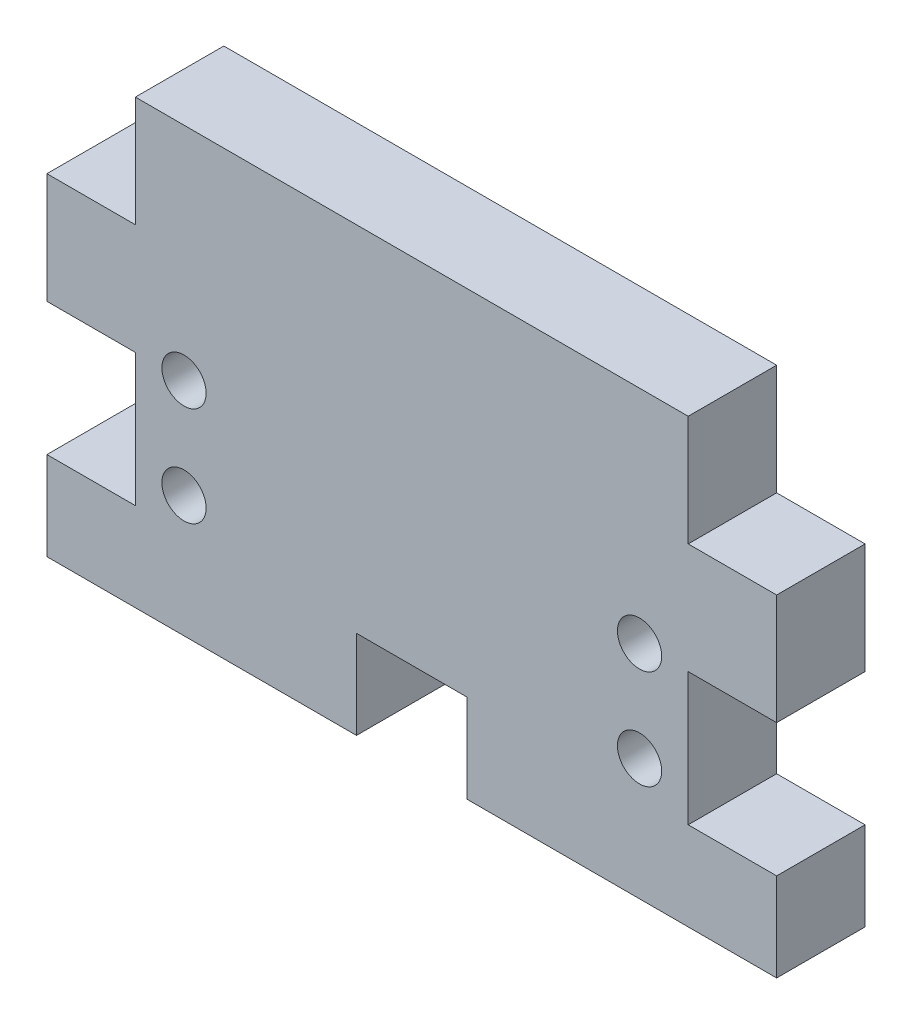
ISO-10303-21;
HEADER;
FILE_DESCRIPTION(('STEP AP214'),'2;1');
FILE_NAME('part.step','',(''),(''),'','','');
FILE_SCHEMA(('AUTOMOTIVE_DESIGN { 1 0 10303 214 1 1 1 1 }'));
ENDSEC;
DATA;
#1=APPLICATION_CONTEXT('core data for automotive mechanical design processes');
#2=APPLICATION_PROTOCOL_DEFINITION('international standard','automotive_design',2000,#1);
#3=PRODUCT_CONTEXT('',#1,'mechanical');
#4=PRODUCT('Part','Part','',(#3));
#5=PRODUCT_RELATED_PRODUCT_CATEGORY('part','',(#4));
#6=PRODUCT_DEFINITION_FORMATION('','',#4);
#7=PRODUCT_DEFINITION_CONTEXT('part definition',#1,'design');
#8=PRODUCT_DEFINITION('design','',#6,#7);
#9=PRODUCT_DEFINITION_SHAPE('','',#8);
#10=(LENGTH_UNIT() NAMED_UNIT(*) SI_UNIT(.MILLI.,.METRE.));
#11=(NAMED_UNIT(*) PLANE_ANGLE_UNIT() SI_UNIT($,.RADIAN.));
#12=(NAMED_UNIT(*) SI_UNIT($,.STERADIAN.) SOLID_ANGLE_UNIT());
#13=UNCERTAINTY_MEASURE_WITH_UNIT(LENGTH_MEASURE(1.E-05),#10,'distance_accuracy_value','');
#14=(GEOMETRIC_REPRESENTATION_CONTEXT(3) GLOBAL_UNCERTAINTY_ASSIGNED_CONTEXT((#13)) GLOBAL_UNIT_ASSIGNED_CONTEXT((#10,
#11,#12)) REPRESENTATION_CONTEXT('',''));
#15=CARTESIAN_POINT('',(0.,0.,0.));
#16=DIRECTION('',(0.,0.,1.));
#17=DIRECTION('',(1.,0.,0.));
#18=AXIS2_PLACEMENT_3D('',#15,#16,#17);
#19=CARTESIAN_POINT('',(0.,0.,4.));
#20=DIRECTION('',(1.,0.,0.));
#21=DIRECTION('',(0.,0.,-1.));
#22=AXIS2_PLACEMENT_3D('',#19,#20,#21);
#23=PLANE('',#22);
#24=DIRECTION('',(0.,-1.,0.));
#25=VECTOR('',#24,1.);
#26=CARTESIAN_POINT('',(0.,0.,4.));
#27=LINE('',#26,#25);
#28=CARTESIAN_POINT('',(0.,4.00000000000002,4.));
#29=VERTEX_POINT('',#28);
#30=CARTESIAN_POINT('',(0.,0.,4.));
#31=VERTEX_POINT('',#30);
#32=EDGE_CURVE('E211',#29,#31,#27,.T.);
#33=ORIENTED_EDGE('',*,*,#32,.F.);
#34=DIRECTION('',(0.,0.,-1.));
#35=VECTOR('',#34,1.);
#36=CARTESIAN_POINT('',(0.,4.00000000000002,4.));
#37=LINE('',#36,#35);
#38=CARTESIAN_POINT('',(0.,4.00000000000002,0.));
#39=VERTEX_POINT('',#38);
#40=EDGE_CURVE('E320',#29,#39,#37,.T.);
#41=ORIENTED_EDGE('',*,*,#40,.T.);
#42=DIRECTION('',(0.,-1.,0.));
#43=VECTOR('',#42,1.);
#44=CARTESIAN_POINT('',(0.,0.,0.));
#45=LINE('',#44,#43);
#46=CARTESIAN_POINT('',(0.,0.,0.));
#47=VERTEX_POINT('',#46);
#48=EDGE_CURVE('E325',#39,#47,#45,.T.);
#49=ORIENTED_EDGE('',*,*,#48,.T.);
#50=DIRECTION('',(0.,0.,-1.));
#51=VECTOR('',#50,1.);
#52=CARTESIAN_POINT('',(0.,0.,4.));
#53=LINE('',#52,#51);
#54=EDGE_CURVE('E12',#31,#47,#53,.T.);
#55=ORIENTED_EDGE('',*,*,#54,.F.);
#56=EDGE_LOOP('',(#33,#41,#49,#55));
#57=FACE_BOUND('',#56,.T.);
#58=ADVANCED_FACE('F41',(#57),#23,.F.);
#59=CARTESIAN_POINT('',(0.,0.,4.));
#60=DIRECTION('',(0.,1.,0.));
#61=DIRECTION('',(0.,0.,1.));
#62=AXIS2_PLACEMENT_3D('',#59,#60,#61);
#63=PLANE('',#62);
#64=DIRECTION('',(1.,0.,0.));
#65=VECTOR('',#64,1.);
#66=CARTESIAN_POINT('',(0.,0.,0.));
#67=LINE('',#66,#65);
#68=CARTESIAN_POINT('',(14.,0.,0.));
#69=VERTEX_POINT('',#68);
#70=EDGE_CURVE('E345',#47,#69,#67,.T.);
#71=ORIENTED_EDGE('',*,*,#70,.T.);
#72=DIRECTION('',(0.,0.,-1.));
#73=VECTOR('',#72,1.);
#74=CARTESIAN_POINT('',(14.,0.,4.));
#75=LINE('',#74,#73);
#76=CARTESIAN_POINT('',(14.,0.,4.));
#77=VERTEX_POINT('',#76);
#78=EDGE_CURVE('E462',#77,#69,#75,.T.);
#79=ORIENTED_EDGE('',*,*,#78,.F.);
#80=DIRECTION('',(1.,0.,0.));
#81=VECTOR('',#80,1.);
#82=CARTESIAN_POINT('',(0.,0.,4.));
#83=LINE('',#82,#81);
#84=EDGE_CURVE('E215',#31,#77,#83,.T.);
#85=ORIENTED_EDGE('',*,*,#84,.F.);
#86=ORIENTED_EDGE('',*,*,#54,.T.);
#87=EDGE_LOOP('',(#71,#79,#85,#86));
#88=FACE_BOUND('',#87,.T.);
#89=ADVANCED_FACE('F383',(#88),#63,.F.);
#90=CARTESIAN_POINT('',(33.,0.,4.));
#91=DIRECTION('',(-1.,0.,0.));
#92=DIRECTION('',(0.,0.,1.));
#93=AXIS2_PLACEMENT_3D('',#90,#91,#92);
#94=PLANE('',#93);
#95=DIRECTION('',(0.,1.,0.));
#96=VECTOR('',#95,1.);
#97=CARTESIAN_POINT('',(33.,0.,0.));
#98=LINE('',#97,#96);
#99=CARTESIAN_POINT('',(33.,9.99999999999994,0.));
#100=VERTEX_POINT('',#99);
#101=CARTESIAN_POINT('',(33.,14.9999999999999,0.));
#102=VERTEX_POINT('',#101);
#103=EDGE_CURVE('E350',#100,#102,#98,.T.);
#104=ORIENTED_EDGE('',*,*,#103,.T.);
#105=DIRECTION('',(0.,0.,-1.));
#106=VECTOR('',#105,1.);
#107=CARTESIAN_POINT('',(33.,14.9999999999999,4.));
#108=LINE('',#107,#106);
#109=CARTESIAN_POINT('',(33.,14.9999999999999,4.));
#110=VERTEX_POINT('',#109);
#111=EDGE_CURVE('E298',#110,#102,#108,.T.);
#112=ORIENTED_EDGE('',*,*,#111,.F.);
#113=DIRECTION('',(0.,1.,0.));
#114=VECTOR('',#113,1.);
#115=CARTESIAN_POINT('',(33.,0.,4.));
#116=LINE('',#115,#114);
#117=CARTESIAN_POINT('',(33.,9.99999999999994,4.));
#118=VERTEX_POINT('',#117);
#119=EDGE_CURVE('E266',#118,#110,#116,.T.);
#120=ORIENTED_EDGE('',*,*,#119,.F.);
#121=DIRECTION('',(0.,0.,-1.));
#122=VECTOR('',#121,1.);
#123=CARTESIAN_POINT('',(33.,9.99999999999994,4.));
#124=LINE('',#123,#122);
#125=EDGE_CURVE('E286',#118,#100,#124,.T.);
#126=ORIENTED_EDGE('',*,*,#125,.T.);
#127=EDGE_LOOP('',(#104,#112,#120,#126));
#128=FACE_BOUND('',#127,.T.);
#129=ADVANCED_FACE('F388',(#128),#94,.F.);
#130=CARTESIAN_POINT('',(0.,15.,0.));
#131=VERTEX_POINT('',#130);
#132=CARTESIAN_POINT('',(0.,10.,0.));
#133=VERTEX_POINT('',#132);
#134=EDGE_CURVE('E199',#131,#133,#45,.T.);
#135=ORIENTED_EDGE('',*,*,#134,.T.);
#136=DIRECTION('',(0.,0.,-1.));
#137=VECTOR('',#136,1.);
#138=CARTESIAN_POINT('',(0.,10.,4.));
#139=LINE('',#138,#137);
#140=CARTESIAN_POINT('',(0.,10.,4.));
#141=VERTEX_POINT('',#140);
#142=EDGE_CURVE('E182',#141,#133,#139,.T.);
#143=ORIENTED_EDGE('',*,*,#142,.F.);
#144=CARTESIAN_POINT('',(0.,15.,4.));
#145=VERTEX_POINT('',#144);
#146=EDGE_CURVE('E197',#145,#141,#27,.T.);
#147=ORIENTED_EDGE('',*,*,#146,.F.);
#148=DIRECTION('',(0.,0.,-1.));
#149=VECTOR('',#148,1.);
#150=CARTESIAN_POINT('',(0.,15.,4.));
#151=LINE('',#150,#149);
#152=EDGE_CURVE('E326',#145,#131,#151,.T.);
#153=ORIENTED_EDGE('',*,*,#152,.T.);
#154=EDGE_LOOP('',(#135,#143,#147,#153));
#155=FACE_BOUND('',#154,.T.);
#156=ADVANCED_FACE('F43',(#155),#23,.F.);
#157=CARTESIAN_POINT('',(19.,0.,4.));
#158=VERTEX_POINT('',#157);
#159=CARTESIAN_POINT('',(33.,0.,4.));
#160=VERTEX_POINT('',#159);
#161=EDGE_CURVE('E210',#158,#160,#83,.T.);
#162=ORIENTED_EDGE('',*,*,#161,.F.);
#163=DIRECTION('',(0.,0.,-1.));
#164=VECTOR('',#163,1.);
#165=CARTESIAN_POINT('',(19.,0.,4.));
#166=LINE('',#165,#164);
#167=CARTESIAN_POINT('',(19.,0.,0.));
#168=VERTEX_POINT('',#167);
#169=EDGE_CURVE('E458',#158,#168,#166,.T.);
#170=ORIENTED_EDGE('',*,*,#169,.T.);
#171=CARTESIAN_POINT('',(33.,0.,0.));
#172=VERTEX_POINT('',#171);
#173=EDGE_CURVE('E342',#168,#172,#67,.T.);
#174=ORIENTED_EDGE('',*,*,#173,.T.);
#175=DIRECTION('',(0.,0.,-1.));
#176=VECTOR('',#175,1.);
#177=CARTESIAN_POINT('',(33.,0.,4.));
#178=LINE('',#177,#176);
#179=EDGE_CURVE('E50',#160,#172,#178,.T.);
#180=ORIENTED_EDGE('',*,*,#179,.F.);
#181=EDGE_LOOP('',(#162,#170,#174,#180));
#182=FACE_BOUND('',#181,.T.);
#183=ADVANCED_FACE('F390',(#182),#63,.F.);
#184=CARTESIAN_POINT('',(33.,3.99999999999996,0.));
#185=VERTEX_POINT('',#184);
#186=EDGE_CURVE('E351',#172,#185,#98,.T.);
#187=ORIENTED_EDGE('',*,*,#186,.T.);
#188=DIRECTION('',(0.,0.,-1.));
#189=VECTOR('',#188,1.);
#190=CARTESIAN_POINT('',(32.9999999999999,3.99999999999996,4.));
#191=LINE('',#190,#189);
#192=CARTESIAN_POINT('',(32.9999999999999,3.99999999999996,4.));
#193=VERTEX_POINT('',#192);
#194=EDGE_CURVE('E410',#193,#185,#191,.T.);
#195=ORIENTED_EDGE('',*,*,#194,.F.);
#196=EDGE_CURVE('E260',#160,#193,#116,.T.);
#197=ORIENTED_EDGE('',*,*,#196,.F.);
#198=ORIENTED_EDGE('',*,*,#179,.T.);
#199=EDGE_LOOP('',(#187,#195,#197,#198));
#200=FACE_BOUND('',#199,.T.);
#201=ADVANCED_FACE('F397',(#200),#94,.F.);
#202=CARTESIAN_POINT('',(0.,20.,4.));
#203=DIRECTION('',(0.,-1.,0.));
#204=DIRECTION('',(0.,0.,-1.));
#205=AXIS2_PLACEMENT_3D('',#202,#203,#204);
#206=PLANE('',#205);
#207=DIRECTION('',(-1.,0.,0.));
#208=VECTOR('',#207,1.);
#209=CARTESIAN_POINT('',(0.,20.,4.));
#210=LINE('',#209,#208);
#211=CARTESIAN_POINT('',(29.,20.,4.));
#212=VERTEX_POINT('',#211);
#213=CARTESIAN_POINT('',(3.99999999999996,20.,4.));
#214=VERTEX_POINT('',#213);
#215=EDGE_CURVE('E265',#212,#214,#210,.T.);
#216=ORIENTED_EDGE('',*,*,#215,.F.);
#217=DIRECTION('',(0.,0.,-1.));
#218=VECTOR('',#217,1.);
#219=CARTESIAN_POINT('',(29.,20.,4.));
#220=LINE('',#219,#218);
#221=CARTESIAN_POINT('',(29.,20.,0.));
#222=VERTEX_POINT('',#221);
#223=EDGE_CURVE('E302',#212,#222,#220,.T.);
#224=ORIENTED_EDGE('',*,*,#223,.T.);
#225=DIRECTION('',(-1.,0.,0.));
#226=VECTOR('',#225,1.);
#227=CARTESIAN_POINT('',(0.,20.,0.));
#228=LINE('',#227,#226);
#229=CARTESIAN_POINT('',(3.99999999999996,20.,0.));
#230=VERTEX_POINT('',#229);
#231=EDGE_CURVE('E217',#222,#230,#228,.T.);
#232=ORIENTED_EDGE('',*,*,#231,.T.);
#233=DIRECTION('',(0.,0.,-1.));
#234=VECTOR('',#233,1.);
#235=CARTESIAN_POINT('',(3.99999999999996,20.,4.));
#236=LINE('',#235,#234);
#237=EDGE_CURVE('E323',#214,#230,#236,.T.);
#238=ORIENTED_EDGE('',*,*,#237,.F.);
#239=EDGE_LOOP('',(#216,#224,#232,#238));
#240=FACE_BOUND('',#239,.T.);
#241=ADVANCED_FACE('F368',(#240),#206,.F.);
#242=CARTESIAN_POINT('',(0.,0.,4.));
#243=DIRECTION('',(0.,0.,-1.));
#244=DIRECTION('',(-1.,0.,0.));
#245=AXIS2_PLACEMENT_3D('',#242,#243,#244);
#246=PLANE('',#245);
#247=CARTESIAN_POINT('',(26.8,10.0000000000001,4.));
#248=DIRECTION('',(0.,0.,1.));
#249=DIRECTION('',(-1.,0.,0.));
#250=AXIS2_PLACEMENT_3D('',#247,#248,#249);
#251=CIRCLE('',#250,1.00000000000001);
#252=CARTESIAN_POINT('',(25.8,10.0000000000001,4.));
#253=VERTEX_POINT('',#252);
#254=EDGE_CURVE('E540',#253,#253,#251,.T.);
#255=ORIENTED_EDGE('',*,*,#254,.F.);
#256=EDGE_LOOP('',(#255));
#257=FACE_BOUND('',#256,.T.);
#258=CARTESIAN_POINT('',(6.19999999999987,5.50000000000007,4.));
#259=DIRECTION('',(0.,0.,1.));
#260=DIRECTION('',(1.,0.,0.));
#261=AXIS2_PLACEMENT_3D('',#258,#259,#260);
#262=CIRCLE('',#261,1.00000000000014);
#263=CARTESIAN_POINT('',(7.20000000000001,5.50000000000007,4.));
#264=VERTEX_POINT('',#263);
#265=EDGE_CURVE('E521',#264,#264,#262,.T.);
#266=ORIENTED_EDGE('',*,*,#265,.F.);
#267=EDGE_LOOP('',(#266));
#268=FACE_BOUND('',#267,.T.);
#269=CARTESIAN_POINT('',(26.8,5.5,4.));
#270=DIRECTION('',(0.,0.,1.));
#271=DIRECTION('',(-1.,0.,0.));
#272=AXIS2_PLACEMENT_3D('',#269,#270,#271);
#273=CIRCLE('',#272,1.00000000000001);
#274=CARTESIAN_POINT('',(25.8,5.5,4.));
#275=VERTEX_POINT('',#274);
#276=EDGE_CURVE('E532',#275,#275,#273,.T.);
#277=ORIENTED_EDGE('',*,*,#276,.F.);
#278=EDGE_LOOP('',(#277));
#279=FACE_BOUND('',#278,.T.);
#280=CARTESIAN_POINT('',(6.2,10.0000000000001,4.));
#281=DIRECTION('',(0.,0.,1.));
#282=DIRECTION('',(1.,0.,0.));
#283=AXIS2_PLACEMENT_3D('',#280,#281,#282);
#284=CIRCLE('',#283,1.);
#285=CARTESIAN_POINT('',(7.2,10.0000000000001,4.));
#286=VERTEX_POINT('',#285);
#287=EDGE_CURVE('E512',#286,#286,#284,.T.);
#288=ORIENTED_EDGE('',*,*,#287,.F.);
#289=EDGE_LOOP('',(#288));
#290=FACE_BOUND('',#289,.T.);
#291=ORIENTED_EDGE('',*,*,#119,.T.);
#292=DIRECTION('',(-1.,0.,0.));
#293=VECTOR('',#292,1.);
#294=CARTESIAN_POINT('',(29.,15.,4.));
#295=LINE('',#294,#293);
#296=CARTESIAN_POINT('',(29.,15.,4.));
#297=VERTEX_POINT('',#296);
#298=EDGE_CURVE('E279',#110,#297,#295,.T.);
#299=ORIENTED_EDGE('',*,*,#298,.T.);
#300=DIRECTION('',(0.,1.,0.));
#301=VECTOR('',#300,1.);
#302=CARTESIAN_POINT('',(29.,15.,4.));
#303=LINE('',#302,#301);
#304=EDGE_CURVE('E284',#297,#212,#303,.T.);
#305=ORIENTED_EDGE('',*,*,#304,.T.);
#306=ORIENTED_EDGE('',*,*,#215,.T.);
#307=DIRECTION('',(0.,-1.,0.));
#308=VECTOR('',#307,1.);
#309=CARTESIAN_POINT('',(3.99999999999996,15.,4.));
#310=LINE('',#309,#308);
#311=CARTESIAN_POINT('',(3.99999999999996,15.,4.));
#312=VERTEX_POINT('',#311);
#313=EDGE_CURVE('E308',#214,#312,#310,.T.);
#314=ORIENTED_EDGE('',*,*,#313,.T.);
#315=DIRECTION('',(-1.,0.,0.));
#316=VECTOR('',#315,1.);
#317=CARTESIAN_POINT('',(3.99999999999996,15.,4.));
#318=LINE('',#317,#316);
#319=EDGE_CURVE('E208',#312,#145,#318,.T.);
#320=ORIENTED_EDGE('',*,*,#319,.T.);
#321=ORIENTED_EDGE('',*,*,#146,.T.);
#322=DIRECTION('',(1.,0.,0.));
#323=VECTOR('',#322,1.);
#324=CARTESIAN_POINT('',(0.,10.,4.));
#325=LINE('',#324,#323);
#326=CARTESIAN_POINT('',(3.99999999999998,10.,4.));
#327=VERTEX_POINT('',#326);
#328=EDGE_CURVE('E178',#141,#327,#325,.T.);
#329=ORIENTED_EDGE('',*,*,#328,.T.);
#330=DIRECTION('',(0.,-1.,0.));
#331=VECTOR('',#330,1.);
#332=CARTESIAN_POINT('',(3.99999999999998,10.,4.));
#333=LINE('',#332,#331);
#334=CARTESIAN_POINT('',(3.99999999999998,4.00000000000002,4.));
#335=VERTEX_POINT('',#334);
#336=EDGE_CURVE('E190',#327,#335,#333,.T.);
#337=ORIENTED_EDGE('',*,*,#336,.T.);
#338=DIRECTION('',(-1.,0.,0.));
#339=VECTOR('',#338,1.);
#340=CARTESIAN_POINT('',(0.,4.00000000000002,4.));
#341=LINE('',#340,#339);
#342=EDGE_CURVE('E201',#335,#29,#341,.T.);
#343=ORIENTED_EDGE('',*,*,#342,.T.);
#344=ORIENTED_EDGE('',*,*,#32,.T.);
#345=ORIENTED_EDGE('',*,*,#84,.T.);
#346=DIRECTION('',(0.,1.,0.));
#347=VECTOR('',#346,1.);
#348=CARTESIAN_POINT('',(14.,4.,4.));
#349=LINE('',#348,#347);
#350=CARTESIAN_POINT('',(14.,4.,4.));
#351=VERTEX_POINT('',#350);
#352=EDGE_CURVE('E238',#77,#351,#349,.T.);
#353=ORIENTED_EDGE('',*,*,#352,.T.);
#354=DIRECTION('',(1.,0.,0.));
#355=VECTOR('',#354,1.);
#356=CARTESIAN_POINT('',(14.,4.,4.));
#357=LINE('',#356,#355);
#358=CARTESIAN_POINT('',(19.,4.,4.));
#359=VERTEX_POINT('',#358);
#360=EDGE_CURVE('E242',#351,#359,#357,.T.);
#361=ORIENTED_EDGE('',*,*,#360,.T.);
#362=DIRECTION('',(0.,-1.,0.));
#363=VECTOR('',#362,1.);
#364=CARTESIAN_POINT('',(19.,4.,4.));
#365=LINE('',#364,#363);
#366=EDGE_CURVE('E249',#359,#158,#365,.T.);
#367=ORIENTED_EDGE('',*,*,#366,.T.);
#368=ORIENTED_EDGE('',*,*,#161,.T.);
#369=ORIENTED_EDGE('',*,*,#196,.T.);
#370=DIRECTION('',(-1.,0.,0.));
#371=VECTOR('',#370,1.);
#372=CARTESIAN_POINT('',(32.9999999999999,3.99999999999996,4.));
#373=LINE('',#372,#371);
#374=CARTESIAN_POINT('',(29.,3.99999999999997,4.));
#375=VERTEX_POINT('',#374);
#376=EDGE_CURVE('E443',#193,#375,#373,.T.);
#377=ORIENTED_EDGE('',*,*,#376,.T.);
#378=DIRECTION('',(0.,1.,0.));
#379=VECTOR('',#378,1.);
#380=CARTESIAN_POINT('',(29.,9.99999999999996,4.));
#381=LINE('',#380,#379);
#382=CARTESIAN_POINT('',(29.,9.99999999999996,4.));
#383=VERTEX_POINT('',#382);
#384=EDGE_CURVE('E438',#375,#383,#381,.T.);
#385=ORIENTED_EDGE('',*,*,#384,.T.);
#386=DIRECTION('',(1.,0.,0.));
#387=VECTOR('',#386,1.);
#388=CARTESIAN_POINT('',(33.,9.99999999999994,4.));
#389=LINE('',#388,#387);
#390=EDGE_CURVE('E425',#383,#118,#389,.T.);
#391=ORIENTED_EDGE('',*,*,#390,.T.);
#392=EDGE_LOOP('',(#291,#299,#305,#306,#314,#320,#321,#329,#337,#343,#344,#345,#353,#361,#367,
#368,#369,#377,#385,#391));
#393=FACE_BOUND('',#392,.T.);
#394=ADVANCED_FACE('F205',(#257,#268,#279,#290,#393),#246,.F.);
#395=CARTESIAN_POINT('',(0.,0.,0.));
#396=DIRECTION('',(0.,0.,-1.));
#397=DIRECTION('',(-1.,0.,0.));
#398=AXIS2_PLACEMENT_3D('',#395,#396,#397);
#399=PLANE('',#398);
#400=CARTESIAN_POINT('',(26.8,10.0000000000001,0.));
#401=DIRECTION('',(0.,0.,1.));
#402=DIRECTION('',(-1.,0.,0.));
#403=AXIS2_PLACEMENT_3D('',#400,#401,#402);
#404=CIRCLE('',#403,1.00000000000001);
#405=CARTESIAN_POINT('',(25.8,10.0000000000001,0.));
#406=VERTEX_POINT('',#405);
#407=EDGE_CURVE('E517',#406,#406,#404,.T.);
#408=ORIENTED_EDGE('',*,*,#407,.T.);
#409=EDGE_LOOP('',(#408));
#410=FACE_BOUND('',#409,.T.);
#411=CARTESIAN_POINT('',(6.19999999999987,5.50000000000007,0.));
#412=DIRECTION('',(0.,0.,1.));
#413=DIRECTION('',(1.,0.,0.));
#414=AXIS2_PLACEMENT_3D('',#411,#412,#413);
#415=CIRCLE('',#414,1.00000000000014);
#416=CARTESIAN_POINT('',(7.20000000000001,5.50000000000007,0.));
#417=VERTEX_POINT('',#416);
#418=EDGE_CURVE('E526',#417,#417,#415,.T.);
#419=ORIENTED_EDGE('',*,*,#418,.T.);
#420=EDGE_LOOP('',(#419));
#421=FACE_BOUND('',#420,.T.);
#422=CARTESIAN_POINT('',(26.8,5.5,0.));
#423=DIRECTION('',(0.,0.,1.));
#424=DIRECTION('',(-1.,0.,0.));
#425=AXIS2_PLACEMENT_3D('',#422,#423,#424);
#426=CIRCLE('',#425,1.00000000000001);
#427=CARTESIAN_POINT('',(25.8,5.5,0.));
#428=VERTEX_POINT('',#427);
#429=EDGE_CURVE('E527',#428,#428,#426,.T.);
#430=ORIENTED_EDGE('',*,*,#429,.T.);
#431=EDGE_LOOP('',(#430));
#432=FACE_BOUND('',#431,.T.);
#433=CARTESIAN_POINT('',(6.2,10.0000000000001,0.));
#434=DIRECTION('',(0.,0.,1.));
#435=DIRECTION('',(1.,0.,0.));
#436=AXIS2_PLACEMENT_3D('',#433,#434,#435);
#437=CIRCLE('',#436,1.);
#438=CARTESIAN_POINT('',(7.2,10.0000000000001,0.));
#439=VERTEX_POINT('',#438);
#440=EDGE_CURVE('E295',#439,#439,#437,.T.);
#441=ORIENTED_EDGE('',*,*,#440,.T.);
#442=EDGE_LOOP('',(#441));
#443=FACE_BOUND('',#442,.T.);
#444=DIRECTION('',(-1.,0.,0.));
#445=VECTOR('',#444,1.);
#446=CARTESIAN_POINT('',(29.,15.,0.));
#447=LINE('',#446,#445);
#448=CARTESIAN_POINT('',(29.,15.,0.));
#449=VERTEX_POINT('',#448);
#450=EDGE_CURVE('E57',#102,#449,#447,.T.);
#451=ORIENTED_EDGE('',*,*,#450,.F.);
#452=ORIENTED_EDGE('',*,*,#103,.F.);
#453=DIRECTION('',(1.,0.,0.));
#454=VECTOR('',#453,1.);
#455=CARTESIAN_POINT('',(33.,9.99999999999994,0.));
#456=LINE('',#455,#454);
#457=CARTESIAN_POINT('',(29.,9.99999999999996,0.));
#458=VERTEX_POINT('',#457);
#459=EDGE_CURVE('E301',#458,#100,#456,.T.);
#460=ORIENTED_EDGE('',*,*,#459,.F.);
#461=DIRECTION('',(0.,1.,0.));
#462=VECTOR('',#461,1.);
#463=CARTESIAN_POINT('',(29.,9.99999999999996,0.));
#464=LINE('',#463,#462);
#465=CARTESIAN_POINT('',(29.,3.99999999999997,0.));
#466=VERTEX_POINT('',#465);
#467=EDGE_CURVE('E419',#466,#458,#464,.T.);
#468=ORIENTED_EDGE('',*,*,#467,.F.);
#469=DIRECTION('',(-1.,0.,0.));
#470=VECTOR('',#469,1.);
#471=CARTESIAN_POINT('',(32.9999999999999,3.99999999999996,0.));
#472=LINE('',#471,#470);
#473=EDGE_CURVE('E416',#185,#466,#472,.T.);
#474=ORIENTED_EDGE('',*,*,#473,.F.);
#475=ORIENTED_EDGE('',*,*,#186,.F.);
#476=ORIENTED_EDGE('',*,*,#173,.F.);
#477=DIRECTION('',(0.,-1.,0.));
#478=VECTOR('',#477,1.);
#479=CARTESIAN_POINT('',(19.,4.,0.));
#480=LINE('',#479,#478);
#481=CARTESIAN_POINT('',(19.,4.,0.));
#482=VERTEX_POINT('',#481);
#483=EDGE_CURVE('E243',#482,#168,#480,.T.);
#484=ORIENTED_EDGE('',*,*,#483,.F.);
#485=DIRECTION('',(1.,0.,0.));
#486=VECTOR('',#485,1.);
#487=CARTESIAN_POINT('',(14.,4.,0.));
#488=LINE('',#487,#486);
#489=CARTESIAN_POINT('',(14.,4.,0.));
#490=VERTEX_POINT('',#489);
#491=EDGE_CURVE('E466',#490,#482,#488,.T.);
#492=ORIENTED_EDGE('',*,*,#491,.F.);
#493=DIRECTION('',(0.,1.,0.));
#494=VECTOR('',#493,1.);
#495=CARTESIAN_POINT('',(14.,4.,0.));
#496=LINE('',#495,#494);
#497=EDGE_CURVE('E65',#69,#490,#496,.T.);
#498=ORIENTED_EDGE('',*,*,#497,.F.);
#499=ORIENTED_EDGE('',*,*,#70,.F.);
#500=ORIENTED_EDGE('',*,*,#48,.F.);
#501=DIRECTION('',(-1.,0.,0.));
#502=VECTOR('',#501,1.);
#503=CARTESIAN_POINT('',(0.,4.00000000000002,0.));
#504=LINE('',#503,#502);
#505=CARTESIAN_POINT('',(3.99999999999998,4.00000000000002,0.));
#506=VERTEX_POINT('',#505);
#507=EDGE_CURVE('E191',#506,#39,#504,.T.);
#508=ORIENTED_EDGE('',*,*,#507,.F.);
#509=DIRECTION('',(0.,-1.,0.));
#510=VECTOR('',#509,1.);
#511=CARTESIAN_POINT('',(3.99999999999998,10.,0.));
#512=LINE('',#511,#510);
#513=CARTESIAN_POINT('',(3.99999999999998,10.,0.));
#514=VERTEX_POINT('',#513);
#515=EDGE_CURVE('E501',#514,#506,#512,.T.);
#516=ORIENTED_EDGE('',*,*,#515,.F.);
#517=DIRECTION('',(1.,0.,0.));
#518=VECTOR('',#517,1.);
#519=CARTESIAN_POINT('',(0.,10.,0.));
#520=LINE('',#519,#518);
#521=EDGE_CURVE('E340',#133,#514,#520,.T.);
#522=ORIENTED_EDGE('',*,*,#521,.F.);
#523=ORIENTED_EDGE('',*,*,#134,.F.);
#524=DIRECTION('',(-1.,0.,0.));
#525=VECTOR('',#524,1.);
#526=CARTESIAN_POINT('',(3.99999999999996,15.,0.));
#527=LINE('',#526,#525);
#528=CARTESIAN_POINT('',(3.99999999999996,15.,0.));
#529=VERTEX_POINT('',#528);
#530=EDGE_CURVE('E312',#529,#131,#527,.T.);
#531=ORIENTED_EDGE('',*,*,#530,.F.);
#532=DIRECTION('',(0.,-1.,0.));
#533=VECTOR('',#532,1.);
#534=CARTESIAN_POINT('',(3.99999999999996,15.,0.));
#535=LINE('',#534,#533);
#536=EDGE_CURVE('E317',#230,#529,#535,.T.);
#537=ORIENTED_EDGE('',*,*,#536,.F.);
#538=ORIENTED_EDGE('',*,*,#231,.F.);
#539=DIRECTION('',(0.,1.,0.));
#540=VECTOR('',#539,1.);
#541=CARTESIAN_POINT('',(29.,15.,0.));
#542=LINE('',#541,#540);
#543=EDGE_CURVE('E285',#449,#222,#542,.T.);
#544=ORIENTED_EDGE('',*,*,#543,.F.);
#545=EDGE_LOOP('',(#451,#452,#460,#468,#474,#475,#476,#484,#492,#498,#499,#500,#508,#516,#522,
#523,#531,#537,#538,#544));
#546=FACE_BOUND('',#545,.T.);
#547=ADVANCED_FACE('F336',(#410,#421,#432,#443,#546),#399,.T.);
#548=CARTESIAN_POINT('',(3.99999999999996,15.,4.));
#549=DIRECTION('',(1.,0.,0.));
#550=DIRECTION('',(0.,0.,-1.));
#551=AXIS2_PLACEMENT_3D('',#548,#549,#550);
#552=PLANE('',#551);
#553=ORIENTED_EDGE('',*,*,#536,.T.);
#554=DIRECTION('',(0.,0.,-1.));
#555=VECTOR('',#554,1.);
#556=CARTESIAN_POINT('',(3.99999999999996,15.,4.));
#557=LINE('',#556,#555);
#558=EDGE_CURVE('E220',#312,#529,#557,.T.);
#559=ORIENTED_EDGE('',*,*,#558,.F.);
#560=ORIENTED_EDGE('',*,*,#313,.F.);
#561=ORIENTED_EDGE('',*,*,#237,.T.);
#562=EDGE_LOOP('',(#553,#559,#560,#561));
#563=FACE_BOUND('',#562,.T.);
#564=ADVANCED_FACE('F369',(#563),#552,.F.);
#565=CARTESIAN_POINT('',(3.99999999999996,15.,4.));
#566=DIRECTION('',(0.,-1.,0.));
#567=DIRECTION('',(0.,0.,-1.));
#568=AXIS2_PLACEMENT_3D('',#565,#566,#567);
#569=PLANE('',#568);
#570=ORIENTED_EDGE('',*,*,#530,.T.);
#571=ORIENTED_EDGE('',*,*,#152,.F.);
#572=ORIENTED_EDGE('',*,*,#319,.F.);
#573=ORIENTED_EDGE('',*,*,#558,.T.);
#574=EDGE_LOOP('',(#570,#571,#572,#573));
#575=FACE_BOUND('',#574,.T.);
#576=ADVANCED_FACE('F332',(#575),#569,.F.);
#577=CARTESIAN_POINT('',(0.,4.00000000000002,4.));
#578=DIRECTION('',(0.,-1.,0.));
#579=DIRECTION('',(0.,0.,-1.));
#580=AXIS2_PLACEMENT_3D('',#577,#578,#579);
#581=PLANE('',#580);
#582=ORIENTED_EDGE('',*,*,#507,.T.);
#583=ORIENTED_EDGE('',*,*,#40,.F.);
#584=ORIENTED_EDGE('',*,*,#342,.F.);
#585=DIRECTION('',(0.,0.,-1.));
#586=VECTOR('',#585,1.);
#587=CARTESIAN_POINT('',(3.99999999999998,4.00000000000002,4.));
#588=LINE('',#587,#586);
#589=EDGE_CURVE('E491',#335,#506,#588,.T.);
#590=ORIENTED_EDGE('',*,*,#589,.T.);
#591=EDGE_LOOP('',(#582,#583,#584,#590));
#592=FACE_BOUND('',#591,.T.);
#593=ADVANCED_FACE('F376',(#592),#581,.F.);
#594=CARTESIAN_POINT('',(3.99999999999998,10.,4.));
#595=DIRECTION('',(1.,0.,0.));
#596=DIRECTION('',(0.,0.,-1.));
#597=AXIS2_PLACEMENT_3D('',#594,#595,#596);
#598=PLANE('',#597);
#599=ORIENTED_EDGE('',*,*,#515,.T.);
#600=ORIENTED_EDGE('',*,*,#589,.F.);
#601=ORIENTED_EDGE('',*,*,#336,.F.);
#602=DIRECTION('',(0.,0.,-1.));
#603=VECTOR('',#602,1.);
#604=CARTESIAN_POINT('',(3.99999999999998,10.,4.));
#605=LINE('',#604,#603);
#606=EDGE_CURVE('E184',#327,#514,#605,.T.);
#607=ORIENTED_EDGE('',*,*,#606,.T.);
#608=EDGE_LOOP('',(#599,#600,#601,#607));
#609=FACE_BOUND('',#608,.T.);
#610=ADVANCED_FACE('F500',(#609),#598,.F.);
#611=CARTESIAN_POINT('',(0.,10.,4.));
#612=DIRECTION('',(0.,1.,0.));
#613=DIRECTION('',(0.,0.,1.));
#614=AXIS2_PLACEMENT_3D('',#611,#612,#613);
#615=PLANE('',#614);
#616=ORIENTED_EDGE('',*,*,#521,.T.);
#617=ORIENTED_EDGE('',*,*,#606,.F.);
#618=ORIENTED_EDGE('',*,*,#328,.F.);
#619=ORIENTED_EDGE('',*,*,#142,.T.);
#620=EDGE_LOOP('',(#616,#617,#618,#619));
#621=FACE_BOUND('',#620,.T.);
#622=ADVANCED_FACE('F181',(#621),#615,.F.);
#623=CARTESIAN_POINT('',(14.,4.,4.));
#624=DIRECTION('',(-1.,0.,0.));
#625=DIRECTION('',(0.,0.,1.));
#626=AXIS2_PLACEMENT_3D('',#623,#624,#625);
#627=PLANE('',#626);
#628=ORIENTED_EDGE('',*,*,#497,.T.);
#629=DIRECTION('',(0.,0.,-1.));
#630=VECTOR('',#629,1.);
#631=CARTESIAN_POINT('',(14.,4.,4.));
#632=LINE('',#631,#630);
#633=EDGE_CURVE('E254',#351,#490,#632,.T.);
#634=ORIENTED_EDGE('',*,*,#633,.F.);
#635=ORIENTED_EDGE('',*,*,#352,.F.);
#636=ORIENTED_EDGE('',*,*,#78,.T.);
#637=EDGE_LOOP('',(#628,#634,#635,#636));
#638=FACE_BOUND('',#637,.T.);
#639=ADVANCED_FACE('F481',(#638),#627,.F.);
#640=CARTESIAN_POINT('',(19.,4.,4.));
#641=DIRECTION('',(1.,0.,0.));
#642=DIRECTION('',(0.,0.,-1.));
#643=AXIS2_PLACEMENT_3D('',#640,#641,#642);
#644=PLANE('',#643);
#645=ORIENTED_EDGE('',*,*,#483,.T.);
#646=ORIENTED_EDGE('',*,*,#169,.F.);
#647=ORIENTED_EDGE('',*,*,#366,.F.);
#648=DIRECTION('',(0.,0.,-1.));
#649=VECTOR('',#648,1.);
#650=CARTESIAN_POINT('',(19.,4.,4.));
#651=LINE('',#650,#649);
#652=EDGE_CURVE('E455',#359,#482,#651,.T.);
#653=ORIENTED_EDGE('',*,*,#652,.T.);
#654=EDGE_LOOP('',(#645,#646,#647,#653));
#655=FACE_BOUND('',#654,.T.);
#656=ADVANCED_FACE('F476',(#655),#644,.F.);
#657=CARTESIAN_POINT('',(14.,4.,4.));
#658=DIRECTION('',(0.,1.,0.));
#659=DIRECTION('',(0.,0.,1.));
#660=AXIS2_PLACEMENT_3D('',#657,#658,#659);
#661=PLANE('',#660);
#662=ORIENTED_EDGE('',*,*,#491,.T.);
#663=ORIENTED_EDGE('',*,*,#652,.F.);
#664=ORIENTED_EDGE('',*,*,#360,.F.);
#665=ORIENTED_EDGE('',*,*,#633,.T.);
#666=EDGE_LOOP('',(#662,#663,#664,#665));
#667=FACE_BOUND('',#666,.T.);
#668=ADVANCED_FACE('F472',(#667),#661,.F.);
#669=CARTESIAN_POINT('',(33.,9.99999999999994,4.));
#670=DIRECTION('',(0.,1.,0.));
#671=DIRECTION('',(-1.,0.,0.));
#672=AXIS2_PLACEMENT_3D('',#669,#670,#671);
#673=PLANE('',#672);
#674=ORIENTED_EDGE('',*,*,#459,.T.);
#675=ORIENTED_EDGE('',*,*,#125,.F.);
#676=ORIENTED_EDGE('',*,*,#390,.F.);
#677=DIRECTION('',(0.,0.,-1.));
#678=VECTOR('',#677,1.);
#679=CARTESIAN_POINT('',(29.,9.99999999999996,4.));
#680=LINE('',#679,#678);
#681=EDGE_CURVE('E430',#383,#458,#680,.T.);
#682=ORIENTED_EDGE('',*,*,#681,.T.);
#683=EDGE_LOOP('',(#674,#675,#676,#682));
#684=FACE_BOUND('',#683,.T.);
#685=ADVANCED_FACE('F594',(#684),#673,.F.);
#686=CARTESIAN_POINT('',(29.,9.99999999999996,4.));
#687=DIRECTION('',(-1.,0.,0.));
#688=DIRECTION('',(0.,-1.,0.));
#689=AXIS2_PLACEMENT_3D('',#686,#687,#688);
#690=PLANE('',#689);
#691=ORIENTED_EDGE('',*,*,#467,.T.);
#692=ORIENTED_EDGE('',*,*,#681,.F.);
#693=ORIENTED_EDGE('',*,*,#384,.F.);
#694=DIRECTION('',(0.,0.,-1.));
#695=VECTOR('',#694,1.);
#696=CARTESIAN_POINT('',(29.,3.99999999999997,4.));
#697=LINE('',#696,#695);
#698=EDGE_CURVE('E433',#375,#466,#697,.T.);
#699=ORIENTED_EDGE('',*,*,#698,.T.);
#700=EDGE_LOOP('',(#691,#692,#693,#699));
#701=FACE_BOUND('',#700,.T.);
#702=ADVANCED_FACE('F597',(#701),#690,.F.);
#703=CARTESIAN_POINT('',(32.9999999999999,3.99999999999996,4.));
#704=DIRECTION('',(0.,-1.,0.));
#705=DIRECTION('',(1.,0.,0.));
#706=AXIS2_PLACEMENT_3D('',#703,#704,#705);
#707=PLANE('',#706);
#708=ORIENTED_EDGE('',*,*,#473,.T.);
#709=ORIENTED_EDGE('',*,*,#698,.F.);
#710=ORIENTED_EDGE('',*,*,#376,.F.);
#711=ORIENTED_EDGE('',*,*,#194,.T.);
#712=EDGE_LOOP('',(#708,#709,#710,#711));
#713=FACE_BOUND('',#712,.T.);
#714=ADVANCED_FACE('F600',(#713),#707,.F.);
#715=CARTESIAN_POINT('',(29.,15.,4.));
#716=DIRECTION('',(0.,-1.,0.));
#717=DIRECTION('',(1.,0.,0.));
#718=AXIS2_PLACEMENT_3D('',#715,#716,#717);
#719=PLANE('',#718);
#720=ORIENTED_EDGE('',*,*,#450,.T.);
#721=DIRECTION('',(0.,0.,-1.));
#722=VECTOR('',#721,1.);
#723=CARTESIAN_POINT('',(29.,15.,4.));
#724=LINE('',#723,#722);
#725=EDGE_CURVE('E292',#297,#449,#724,.T.);
#726=ORIENTED_EDGE('',*,*,#725,.F.);
#727=ORIENTED_EDGE('',*,*,#298,.F.);
#728=ORIENTED_EDGE('',*,*,#111,.T.);
#729=EDGE_LOOP('',(#720,#726,#727,#728));
#730=FACE_BOUND('',#729,.T.);
#731=ADVANCED_FACE('F578',(#730),#719,.F.);
#732=CARTESIAN_POINT('',(29.,15.,4.));
#733=DIRECTION('',(-1.,0.,0.));
#734=DIRECTION('',(0.,-1.,0.));
#735=AXIS2_PLACEMENT_3D('',#732,#733,#734);
#736=PLANE('',#735);
#737=ORIENTED_EDGE('',*,*,#543,.T.);
#738=ORIENTED_EDGE('',*,*,#223,.F.);
#739=ORIENTED_EDGE('',*,*,#304,.F.);
#740=ORIENTED_EDGE('',*,*,#725,.T.);
#741=EDGE_LOOP('',(#737,#738,#739,#740));
#742=FACE_BOUND('',#741,.T.);
#743=ADVANCED_FACE('F569',(#742),#736,.F.);
#744=CARTESIAN_POINT('',(6.2,10.0000000000001,0.));
#745=DIRECTION('',(0.,0.,1.));
#746=DIRECTION('',(1.,0.,0.));
#747=AXIS2_PLACEMENT_3D('',#744,#745,#746);
#748=CYLINDRICAL_SURFACE('',#747,1.);
#749=ORIENTED_EDGE('',*,*,#440,.F.);
#750=EDGE_LOOP('',(#749));
#751=FACE_BOUND('',#750,.T.);
#752=ORIENTED_EDGE('',*,*,#287,.T.);
#753=EDGE_LOOP('',(#752));
#754=FACE_BOUND('',#753,.T.);
#755=ADVANCED_FACE('F567',(#751,#754),#748,.F.);
#756=CARTESIAN_POINT('',(26.8,5.5,0.));
#757=DIRECTION('',(0.,0.,1.));
#758=DIRECTION('',(1.,0.,0.));
#759=AXIS2_PLACEMENT_3D('',#756,#757,#758);
#760=CYLINDRICAL_SURFACE('',#759,1.00000000000001);
#761=ORIENTED_EDGE('',*,*,#429,.F.);
#762=EDGE_LOOP('',(#761));
#763=FACE_BOUND('',#762,.T.);
#764=ORIENTED_EDGE('',*,*,#276,.T.);
#765=EDGE_LOOP('',(#764));
#766=FACE_BOUND('',#765,.T.);
#767=ADVANCED_FACE('F556',(#763,#766),#760,.F.);
#768=CARTESIAN_POINT('',(6.19999999999987,5.50000000000007,0.));
#769=DIRECTION('',(0.,0.,1.));
#770=DIRECTION('',(1.,0.,0.));
#771=AXIS2_PLACEMENT_3D('',#768,#769,#770);
#772=CYLINDRICAL_SURFACE('',#771,1.00000000000014);
#773=ORIENTED_EDGE('',*,*,#418,.F.);
#774=EDGE_LOOP('',(#773));
#775=FACE_BOUND('',#774,.T.);
#776=ORIENTED_EDGE('',*,*,#265,.T.);
#777=EDGE_LOOP('',(#776));
#778=FACE_BOUND('',#777,.T.);
#779=ADVANCED_FACE('F552',(#775,#778),#772,.F.);
#780=CARTESIAN_POINT('',(26.8,10.0000000000001,0.));
#781=DIRECTION('',(0.,0.,1.));
#782=DIRECTION('',(1.,0.,0.));
#783=AXIS2_PLACEMENT_3D('',#780,#781,#782);
#784=CYLINDRICAL_SURFACE('',#783,1.00000000000001);
#785=ORIENTED_EDGE('',*,*,#407,.F.);
#786=EDGE_LOOP('',(#785));
#787=FACE_BOUND('',#786,.T.);
#788=ORIENTED_EDGE('',*,*,#254,.T.);
#789=EDGE_LOOP('',(#788));
#790=FACE_BOUND('',#789,.T.);
#791=ADVANCED_FACE('F555',(#787,#790),#784,.F.);
#792=CLOSED_SHELL('',(#58,#89,#129,#156,#183,#201,#241,#394,#547,#564,#576,#593,#610,#622,#639,
#656,#668,#685,#702,#714,#731,#743,#755,#767,#779,#791));
#793=MANIFOLD_SOLID_BREP('B2',#792);
#794=ADVANCED_BREP_SHAPE_REPRESENTATION('',(#18,#793),#14);
#795=SHAPE_DEFINITION_REPRESENTATION(#9,#794);
ENDSEC;
END-ISO-10303-21;
